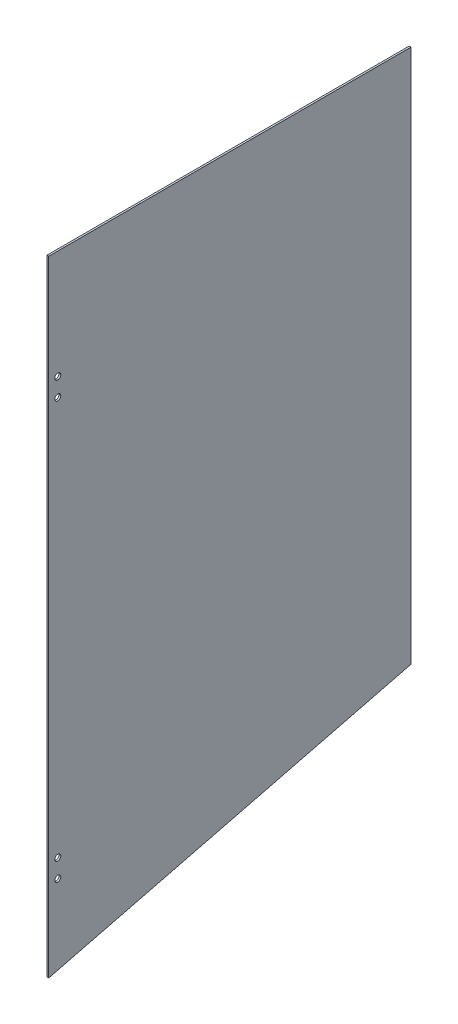
ISO-10303-21;
HEADER;
FILE_DESCRIPTION(('STEP AP214'),'2;1');
FILE_NAME('part.step','',(''),(''),'','','');
FILE_SCHEMA(('AUTOMOTIVE_DESIGN { 1 0 10303 214 1 1 1 1 }'));
ENDSEC;
DATA;
#1=APPLICATION_CONTEXT('core data for automotive mechanical design processes');
#2=APPLICATION_PROTOCOL_DEFINITION('international standard','automotive_design',2000,#1);
#3=PRODUCT_CONTEXT('',#1,'mechanical');
#4=PRODUCT('Part','Part','',(#3));
#5=PRODUCT_RELATED_PRODUCT_CATEGORY('part','',(#4));
#6=PRODUCT_DEFINITION_FORMATION('','',#4);
#7=PRODUCT_DEFINITION_CONTEXT('part definition',#1,'design');
#8=PRODUCT_DEFINITION('design','',#6,#7);
#9=PRODUCT_DEFINITION_SHAPE('','',#8);
#10=(LENGTH_UNIT() NAMED_UNIT(*) SI_UNIT(.MILLI.,.METRE.));
#11=(NAMED_UNIT(*) PLANE_ANGLE_UNIT() SI_UNIT($,.RADIAN.));
#12=(NAMED_UNIT(*) SI_UNIT($,.STERADIAN.) SOLID_ANGLE_UNIT());
#13=UNCERTAINTY_MEASURE_WITH_UNIT(LENGTH_MEASURE(1.E-05),#10,'distance_accuracy_value','');
#14=(GEOMETRIC_REPRESENTATION_CONTEXT(3) GLOBAL_UNCERTAINTY_ASSIGNED_CONTEXT((#13)) GLOBAL_UNIT_ASSIGNED_CONTEXT((#10,
#11,#12)) REPRESENTATION_CONTEXT('',''));
#15=CARTESIAN_POINT('',(0.,0.,0.));
#16=DIRECTION('',(0.,0.,1.));
#17=DIRECTION('',(1.,0.,0.));
#18=AXIS2_PLACEMENT_3D('',#15,#16,#17);
#19=CARTESIAN_POINT('',(1.,-138.823529411765,-34.7058823529412));
#20=DIRECTION('',(0.,0.970142500145332,0.242535625036333));
#21=DIRECTION('',(0.,-0.242535625036333,0.970142500145332));
#22=AXIS2_PLACEMENT_3D('',#19,#20,#21);
#23=PLANE('',#22);
#24=DIRECTION('',(0.,0.242535625036333,-0.970142500145332));
#25=VECTOR('',#24,1.);
#26=CARTESIAN_POINT('',(0.,-138.823529411765,-34.7058823529412));
#27=LINE('',#26,#25);
#28=CARTESIAN_POINT('',(0.,-172.5,100.));
#29=VERTEX_POINT('',#28);
#30=CARTESIAN_POINT('',(0.,-122.5,-100.));
#31=VERTEX_POINT('',#30);
#32=EDGE_CURVE('E113',#29,#31,#27,.T.);
#33=ORIENTED_EDGE('',*,*,#32,.T.);
#34=DIRECTION('',(-1.,0.,0.));
#35=VECTOR('',#34,1.);
#36=CARTESIAN_POINT('',(1.,-122.5,-100.));
#37=LINE('',#36,#35);
#38=CARTESIAN_POINT('',(1.,-122.5,-100.));
#39=VERTEX_POINT('',#38);
#40=EDGE_CURVE('E11',#39,#31,#37,.T.);
#41=ORIENTED_EDGE('',*,*,#40,.F.);
#42=DIRECTION('',(0.,0.242535625036333,-0.970142500145332));
#43=VECTOR('',#42,1.);
#44=CARTESIAN_POINT('',(1.,-138.823529411765,-34.7058823529412));
#45=LINE('',#44,#43);
#46=CARTESIAN_POINT('',(1.,-172.5,100.));
#47=VERTEX_POINT('',#46);
#48=EDGE_CURVE('E95',#47,#39,#45,.T.);
#49=ORIENTED_EDGE('',*,*,#48,.F.);
#50=DIRECTION('',(-1.,0.,0.));
#51=VECTOR('',#50,1.);
#52=CARTESIAN_POINT('',(1.,-172.5,100.));
#53=LINE('',#52,#51);
#54=EDGE_CURVE('E62',#47,#29,#53,.T.);
#55=ORIENTED_EDGE('',*,*,#54,.T.);
#56=EDGE_LOOP('',(#33,#41,#49,#55));
#57=FACE_BOUND('',#56,.T.);
#58=ADVANCED_FACE('F45',(#57),#23,.F.);
#59=CARTESIAN_POINT('',(1.,0.,-100.));
#60=DIRECTION('',(0.,0.,1.));
#61=DIRECTION('',(1.,0.,0.));
#62=AXIS2_PLACEMENT_3D('',#59,#60,#61);
#63=PLANE('',#62);
#64=DIRECTION('',(0.,1.,0.));
#65=VECTOR('',#64,1.);
#66=CARTESIAN_POINT('',(0.,0.,-100.));
#67=LINE('',#66,#65);
#68=CARTESIAN_POINT('',(0.,172.5,-100.));
#69=VERTEX_POINT('',#68);
#70=EDGE_CURVE('E101',#31,#69,#67,.T.);
#71=ORIENTED_EDGE('',*,*,#70,.T.);
#72=DIRECTION('',(-1.,0.,0.));
#73=VECTOR('',#72,1.);
#74=CARTESIAN_POINT('',(1.,172.5,-100.));
#75=LINE('',#74,#73);
#76=CARTESIAN_POINT('',(1.,172.5,-100.));
#77=VERTEX_POINT('',#76);
#78=EDGE_CURVE('E54',#77,#69,#75,.T.);
#79=ORIENTED_EDGE('',*,*,#78,.F.);
#80=DIRECTION('',(0.,1.,0.));
#81=VECTOR('',#80,1.);
#82=CARTESIAN_POINT('',(1.,0.,-100.));
#83=LINE('',#82,#81);
#84=EDGE_CURVE('E87',#39,#77,#83,.T.);
#85=ORIENTED_EDGE('',*,*,#84,.F.);
#86=ORIENTED_EDGE('',*,*,#40,.T.);
#87=EDGE_LOOP('',(#71,#79,#85,#86));
#88=FACE_BOUND('',#87,.T.);
#89=ADVANCED_FACE('F100',(#88),#63,.F.);
#90=CARTESIAN_POINT('',(1.,172.5,0.));
#91=DIRECTION('',(0.,1.,0.));
#92=DIRECTION('',(0.,0.,1.));
#93=AXIS2_PLACEMENT_3D('',#90,#91,#92);
#94=PLANE('',#93);
#95=DIRECTION('',(0.,0.,-1.));
#96=VECTOR('',#95,1.);
#97=CARTESIAN_POINT('',(0.,172.5,0.));
#98=LINE('',#97,#96);
#99=CARTESIAN_POINT('',(0.,172.5,100.));
#100=VERTEX_POINT('',#99);
#101=EDGE_CURVE('E119',#100,#69,#98,.T.);
#102=ORIENTED_EDGE('',*,*,#101,.F.);
#103=DIRECTION('',(-1.,0.,0.));
#104=VECTOR('',#103,1.);
#105=CARTESIAN_POINT('',(1.,172.5,100.));
#106=LINE('',#105,#104);
#107=CARTESIAN_POINT('',(1.,172.5,100.));
#108=VERTEX_POINT('',#107);
#109=EDGE_CURVE('E76',#108,#100,#106,.T.);
#110=ORIENTED_EDGE('',*,*,#109,.F.);
#111=DIRECTION('',(0.,0.,-1.));
#112=VECTOR('',#111,1.);
#113=CARTESIAN_POINT('',(1.,172.5,0.));
#114=LINE('',#113,#112);
#115=EDGE_CURVE('E94',#108,#77,#114,.T.);
#116=ORIENTED_EDGE('',*,*,#115,.T.);
#117=ORIENTED_EDGE('',*,*,#78,.T.);
#118=EDGE_LOOP('',(#102,#110,#116,#117));
#119=FACE_BOUND('',#118,.T.);
#120=ADVANCED_FACE('F105',(#119),#94,.T.);
#121=CARTESIAN_POINT('',(1.,0.,100.));
#122=DIRECTION('',(0.,0.,1.));
#123=DIRECTION('',(1.,0.,0.));
#124=AXIS2_PLACEMENT_3D('',#121,#122,#123);
#125=PLANE('',#124);
#126=DIRECTION('',(0.,1.,0.));
#127=VECTOR('',#126,1.);
#128=CARTESIAN_POINT('',(0.,0.,100.));
#129=LINE('',#128,#127);
#130=EDGE_CURVE('E122',#29,#100,#129,.T.);
#131=ORIENTED_EDGE('',*,*,#130,.F.);
#132=ORIENTED_EDGE('',*,*,#54,.F.);
#133=DIRECTION('',(0.,1.,0.));
#134=VECTOR('',#133,1.);
#135=CARTESIAN_POINT('',(1.,0.,100.));
#136=LINE('',#135,#134);
#137=EDGE_CURVE('E107',#47,#108,#136,.T.);
#138=ORIENTED_EDGE('',*,*,#137,.T.);
#139=ORIENTED_EDGE('',*,*,#109,.T.);
#140=EDGE_LOOP('',(#131,#132,#138,#139));
#141=FACE_BOUND('',#140,.T.);
#142=ADVANCED_FACE('F169',(#141),#125,.T.);
#143=CARTESIAN_POINT('',(1.,0.,0.));
#144=DIRECTION('',(1.,0.,0.));
#145=DIRECTION('',(0.,0.,-1.));
#146=AXIS2_PLACEMENT_3D('',#143,#144,#145);
#147=PLANE('',#146);
#148=CARTESIAN_POINT('',(1.,112.5,95.));
#149=DIRECTION('',(1.,0.,0.));
#150=DIRECTION('',(0.,0.,-1.));
#151=AXIS2_PLACEMENT_3D('',#148,#149,#150);
#152=CIRCLE('',#151,1.65);
#153=CARTESIAN_POINT('',(1.,112.5,93.35));
#154=VERTEX_POINT('',#153);
#155=EDGE_CURVE('E159',#154,#154,#152,.T.);
#156=ORIENTED_EDGE('',*,*,#155,.F.);
#157=EDGE_LOOP('',(#156));
#158=FACE_BOUND('',#157,.T.);
#159=CARTESIAN_POINT('',(1.,102.5,95.));
#160=DIRECTION('',(1.,0.,0.));
#161=DIRECTION('',(0.,0.,-1.));
#162=AXIS2_PLACEMENT_3D('',#159,#160,#161);
#163=CIRCLE('',#162,1.65);
#164=CARTESIAN_POINT('',(1.,102.5,93.35));
#165=VERTEX_POINT('',#164);
#166=EDGE_CURVE('E151',#165,#165,#163,.T.);
#167=ORIENTED_EDGE('',*,*,#166,.F.);
#168=EDGE_LOOP('',(#167));
#169=FACE_BOUND('',#168,.T.);
#170=CARTESIAN_POINT('',(1.,-117.5,95.));
#171=DIRECTION('',(1.,0.,0.));
#172=DIRECTION('',(0.,0.,-1.));
#173=AXIS2_PLACEMENT_3D('',#170,#171,#172);
#174=CIRCLE('',#173,1.65);
#175=CARTESIAN_POINT('',(1.,-117.5,93.35));
#176=VERTEX_POINT('',#175);
#177=EDGE_CURVE('E143',#176,#176,#174,.T.);
#178=ORIENTED_EDGE('',*,*,#177,.F.);
#179=EDGE_LOOP('',(#178));
#180=FACE_BOUND('',#179,.T.);
#181=CARTESIAN_POINT('',(1.,-127.5,95.));
#182=DIRECTION('',(1.,0.,0.));
#183=DIRECTION('',(0.,0.,-1.));
#184=AXIS2_PLACEMENT_3D('',#181,#182,#183);
#185=CIRCLE('',#184,1.65000000000001);
#186=CARTESIAN_POINT('',(1.,-127.5,93.35));
#187=VERTEX_POINT('',#186);
#188=EDGE_CURVE('E135',#187,#187,#185,.T.);
#189=ORIENTED_EDGE('',*,*,#188,.F.);
#190=EDGE_LOOP('',(#189));
#191=FACE_BOUND('',#190,.T.);
#192=ORIENTED_EDGE('',*,*,#48,.T.);
#193=ORIENTED_EDGE('',*,*,#84,.T.);
#194=ORIENTED_EDGE('',*,*,#115,.F.);
#195=ORIENTED_EDGE('',*,*,#137,.F.);
#196=EDGE_LOOP('',(#192,#193,#194,#195));
#197=FACE_BOUND('',#196,.T.);
#198=ADVANCED_FACE('F91',(#158,#169,#180,#191,#197),#147,.T.);
#199=CARTESIAN_POINT('',(0.,0.,0.));
#200=DIRECTION('',(1.,0.,0.));
#201=DIRECTION('',(0.,0.,-1.));
#202=AXIS2_PLACEMENT_3D('',#199,#200,#201);
#203=PLANE('',#202);
#204=CARTESIAN_POINT('',(0.,112.5,95.));
#205=DIRECTION('',(1.,0.,0.));
#206=DIRECTION('',(0.,0.,-1.));
#207=AXIS2_PLACEMENT_3D('',#204,#205,#206);
#208=CIRCLE('',#207,1.65);
#209=CARTESIAN_POINT('',(0.,112.5,93.35));
#210=VERTEX_POINT('',#209);
#211=EDGE_CURVE('E155',#210,#210,#208,.T.);
#212=ORIENTED_EDGE('',*,*,#211,.T.);
#213=EDGE_LOOP('',(#212));
#214=FACE_BOUND('',#213,.T.);
#215=CARTESIAN_POINT('',(0.,102.5,95.));
#216=DIRECTION('',(1.,0.,0.));
#217=DIRECTION('',(0.,0.,-1.));
#218=AXIS2_PLACEMENT_3D('',#215,#216,#217);
#219=CIRCLE('',#218,1.65);
#220=CARTESIAN_POINT('',(0.,102.5,93.35));
#221=VERTEX_POINT('',#220);
#222=EDGE_CURVE('E147',#221,#221,#219,.T.);
#223=ORIENTED_EDGE('',*,*,#222,.T.);
#224=EDGE_LOOP('',(#223));
#225=FACE_BOUND('',#224,.T.);
#226=CARTESIAN_POINT('',(0.,-117.5,95.));
#227=DIRECTION('',(1.,0.,0.));
#228=DIRECTION('',(0.,0.,-1.));
#229=AXIS2_PLACEMENT_3D('',#226,#227,#228);
#230=CIRCLE('',#229,1.65);
#231=CARTESIAN_POINT('',(0.,-117.5,93.35));
#232=VERTEX_POINT('',#231);
#233=EDGE_CURVE('E139',#232,#232,#230,.T.);
#234=ORIENTED_EDGE('',*,*,#233,.T.);
#235=EDGE_LOOP('',(#234));
#236=FACE_BOUND('',#235,.T.);
#237=CARTESIAN_POINT('',(0.,-127.5,95.));
#238=DIRECTION('',(1.,0.,0.));
#239=DIRECTION('',(0.,0.,-1.));
#240=AXIS2_PLACEMENT_3D('',#237,#238,#239);
#241=CIRCLE('',#240,1.65000000000001);
#242=CARTESIAN_POINT('',(0.,-127.5,93.35));
#243=VERTEX_POINT('',#242);
#244=EDGE_CURVE('E116',#243,#243,#241,.T.);
#245=ORIENTED_EDGE('',*,*,#244,.T.);
#246=EDGE_LOOP('',(#245));
#247=FACE_BOUND('',#246,.T.);
#248=ORIENTED_EDGE('',*,*,#32,.F.);
#249=ORIENTED_EDGE('',*,*,#130,.T.);
#250=ORIENTED_EDGE('',*,*,#101,.T.);
#251=ORIENTED_EDGE('',*,*,#70,.F.);
#252=EDGE_LOOP('',(#248,#249,#250,#251));
#253=FACE_BOUND('',#252,.T.);
#254=ADVANCED_FACE('F168',(#214,#225,#236,#247,#253),#203,.F.);
#255=CARTESIAN_POINT('',(1.,-127.5,95.));
#256=DIRECTION('',(1.,0.,0.));
#257=DIRECTION('',(0.,0.,-1.));
#258=AXIS2_PLACEMENT_3D('',#255,#256,#257);
#259=CYLINDRICAL_SURFACE('',#258,1.65000000000001);
#260=ORIENTED_EDGE('',*,*,#244,.F.);
#261=EDGE_LOOP('',(#260));
#262=FACE_BOUND('',#261,.T.);
#263=ORIENTED_EDGE('',*,*,#188,.T.);
#264=EDGE_LOOP('',(#263));
#265=FACE_BOUND('',#264,.T.);
#266=ADVANCED_FACE('F177',(#262,#265),#259,.F.);
#267=CARTESIAN_POINT('',(1.,-117.5,95.));
#268=DIRECTION('',(1.,0.,0.));
#269=DIRECTION('',(0.,0.,-1.));
#270=AXIS2_PLACEMENT_3D('',#267,#268,#269);
#271=CYLINDRICAL_SURFACE('',#270,1.65);
#272=ORIENTED_EDGE('',*,*,#233,.F.);
#273=EDGE_LOOP('',(#272));
#274=FACE_BOUND('',#273,.T.);
#275=ORIENTED_EDGE('',*,*,#177,.T.);
#276=EDGE_LOOP('',(#275));
#277=FACE_BOUND('',#276,.T.);
#278=ADVANCED_FACE('F179',(#274,#277),#271,.F.);
#279=CARTESIAN_POINT('',(1.,102.5,95.));
#280=DIRECTION('',(1.,0.,0.));
#281=DIRECTION('',(0.,0.,-1.));
#282=AXIS2_PLACEMENT_3D('',#279,#280,#281);
#283=CYLINDRICAL_SURFACE('',#282,1.65);
#284=ORIENTED_EDGE('',*,*,#222,.F.);
#285=EDGE_LOOP('',(#284));
#286=FACE_BOUND('',#285,.T.);
#287=ORIENTED_EDGE('',*,*,#166,.T.);
#288=EDGE_LOOP('',(#287));
#289=FACE_BOUND('',#288,.T.);
#290=ADVANCED_FACE('F186',(#286,#289),#283,.F.);
#291=CARTESIAN_POINT('',(1.,112.5,95.));
#292=DIRECTION('',(1.,0.,0.));
#293=DIRECTION('',(0.,0.,-1.));
#294=AXIS2_PLACEMENT_3D('',#291,#292,#293);
#295=CYLINDRICAL_SURFACE('',#294,1.65);
#296=ORIENTED_EDGE('',*,*,#211,.F.);
#297=EDGE_LOOP('',(#296));
#298=FACE_BOUND('',#297,.T.);
#299=ORIENTED_EDGE('',*,*,#155,.T.);
#300=EDGE_LOOP('',(#299));
#301=FACE_BOUND('',#300,.T.);
#302=ADVANCED_FACE('F164',(#298,#301),#295,.F.);
#303=CLOSED_SHELL('',(#58,#89,#120,#142,#198,#254,#266,#278,#290,#302));
#304=MANIFOLD_SOLID_BREP('B2',#303);
#305=ADVANCED_BREP_SHAPE_REPRESENTATION('',(#18,#304),#14);
#306=SHAPE_DEFINITION_REPRESENTATION(#9,#305);
ENDSEC;
END-ISO-10303-21;
